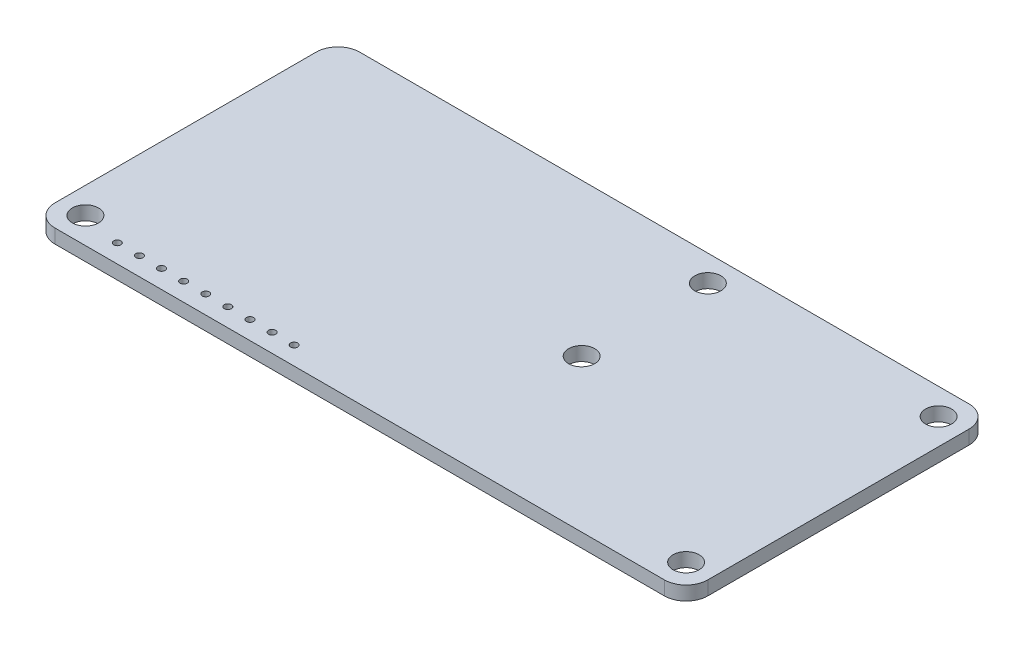
ISO-10303-21;
HEADER;
FILE_DESCRIPTION(('STEP AP214'),'2;1');
FILE_NAME('part.step','',(''),(''),'','','');
FILE_SCHEMA(('AUTOMOTIVE_DESIGN { 1 0 10303 214 1 1 1 1 }'));
ENDSEC;
DATA;
#1=APPLICATION_CONTEXT('core data for automotive mechanical design processes');
#2=APPLICATION_PROTOCOL_DEFINITION('international standard','automotive_design',2000,#1);
#3=PRODUCT_CONTEXT('',#1,'mechanical');
#4=PRODUCT('Part','Part','',(#3));
#5=PRODUCT_RELATED_PRODUCT_CATEGORY('part','',(#4));
#6=PRODUCT_DEFINITION_FORMATION('','',#4);
#7=PRODUCT_DEFINITION_CONTEXT('part definition',#1,'design');
#8=PRODUCT_DEFINITION('design','',#6,#7);
#9=PRODUCT_DEFINITION_SHAPE('','',#8);
#10=(LENGTH_UNIT() NAMED_UNIT(*) SI_UNIT(.MILLI.,.METRE.));
#11=(NAMED_UNIT(*) PLANE_ANGLE_UNIT() SI_UNIT($,.RADIAN.));
#12=(NAMED_UNIT(*) SI_UNIT($,.STERADIAN.) SOLID_ANGLE_UNIT());
#13=UNCERTAINTY_MEASURE_WITH_UNIT(LENGTH_MEASURE(1.E-05),#10,'distance_accuracy_value','');
#14=(GEOMETRIC_REPRESENTATION_CONTEXT(3) GLOBAL_UNCERTAINTY_ASSIGNED_CONTEXT((#13)) GLOBAL_UNIT_ASSIGNED_CONTEXT((#10,
#11,#12)) REPRESENTATION_CONTEXT('',''));
#15=CARTESIAN_POINT('',(0.,0.,0.));
#16=DIRECTION('',(0.,0.,1.));
#17=DIRECTION('',(1.,0.,0.));
#18=AXIS2_PLACEMENT_3D('',#15,#16,#17);
#19=CARTESIAN_POINT('',(-35.,1.6,15.));
#20=DIRECTION('',(0.,-1.,0.));
#21=DIRECTION('',(0.,0.,-1.));
#22=AXIS2_PLACEMENT_3D('',#19,#20,#21);
#23=CYLINDRICAL_SURFACE('',#22,2.5);
#24=CARTESIAN_POINT('',(-35.,0.,15.));
#25=DIRECTION('',(0.,1.,0.));
#26=DIRECTION('',(0.,0.,1.));
#27=AXIS2_PLACEMENT_3D('',#24,#25,#26);
#28=CIRCLE('',#27,2.5);
#29=CARTESIAN_POINT('',(-37.5,0.,15.));
#30=VERTEX_POINT('',#29);
#31=CARTESIAN_POINT('',(-35.,0.,17.5));
#32=VERTEX_POINT('',#31);
#33=EDGE_CURVE('E142',#30,#32,#28,.T.);
#34=ORIENTED_EDGE('',*,*,#33,.T.);
#35=DIRECTION('',(0.,-1.,0.));
#36=VECTOR('',#35,1.);
#37=CARTESIAN_POINT('',(-35.,1.6,17.5));
#38=LINE('',#37,#36);
#39=CARTESIAN_POINT('',(-35.,1.6,17.5));
#40=VERTEX_POINT('',#39);
#41=EDGE_CURVE('E11',#40,#32,#38,.T.);
#42=ORIENTED_EDGE('',*,*,#41,.F.);
#43=CARTESIAN_POINT('',(-35.,1.6,15.));
#44=DIRECTION('',(0.,1.,0.));
#45=DIRECTION('',(0.,0.,1.));
#46=AXIS2_PLACEMENT_3D('',#43,#44,#45);
#47=CIRCLE('',#46,2.5);
#48=CARTESIAN_POINT('',(-37.5,1.6,15.));
#49=VERTEX_POINT('',#48);
#50=EDGE_CURVE('E165',#49,#40,#47,.T.);
#51=ORIENTED_EDGE('',*,*,#50,.F.);
#52=DIRECTION('',(0.,-1.,0.));
#53=VECTOR('',#52,1.);
#54=CARTESIAN_POINT('',(-37.5,1.6,15.));
#55=LINE('',#54,#53);
#56=EDGE_CURVE('E138',#49,#30,#55,.T.);
#57=ORIENTED_EDGE('',*,*,#56,.T.);
#58=EDGE_LOOP('',(#34,#42,#51,#57));
#59=FACE_BOUND('',#58,.T.);
#60=ADVANCED_FACE('F41',(#59),#23,.T.);
#61=CARTESIAN_POINT('',(-35.,1.6,17.5));
#62=DIRECTION('',(0.,0.,-1.));
#63=DIRECTION('',(-1.,0.,0.));
#64=AXIS2_PLACEMENT_3D('',#61,#62,#63);
#65=PLANE('',#64);
#66=DIRECTION('',(1.,0.,0.));
#67=VECTOR('',#66,1.);
#68=CARTESIAN_POINT('',(-35.,0.,17.5));
#69=LINE('',#68,#67);
#70=CARTESIAN_POINT('',(35.,0.,17.5));
#71=VERTEX_POINT('',#70);
#72=EDGE_CURVE('E146',#32,#71,#69,.T.);
#73=ORIENTED_EDGE('',*,*,#72,.T.);
#74=DIRECTION('',(0.,-1.,0.));
#75=VECTOR('',#74,1.);
#76=CARTESIAN_POINT('',(35.,1.6,17.5));
#77=LINE('',#76,#75);
#78=CARTESIAN_POINT('',(35.,1.6,17.5));
#79=VERTEX_POINT('',#78);
#80=EDGE_CURVE('E50',#79,#71,#77,.T.);
#81=ORIENTED_EDGE('',*,*,#80,.F.);
#82=DIRECTION('',(1.,0.,0.));
#83=VECTOR('',#82,1.);
#84=CARTESIAN_POINT('',(-35.,1.6,17.5));
#85=LINE('',#84,#83);
#86=EDGE_CURVE('E101',#40,#79,#85,.T.);
#87=ORIENTED_EDGE('',*,*,#86,.F.);
#88=ORIENTED_EDGE('',*,*,#41,.T.);
#89=EDGE_LOOP('',(#73,#81,#87,#88));
#90=FACE_BOUND('',#89,.T.);
#91=ADVANCED_FACE('F376',(#90),#65,.F.);
#92=CARTESIAN_POINT('',(35.,1.6,15.));
#93=DIRECTION('',(0.,-1.,0.));
#94=DIRECTION('',(0.,0.,-1.));
#95=AXIS2_PLACEMENT_3D('',#92,#93,#94);
#96=CYLINDRICAL_SURFACE('',#95,2.5);
#97=CARTESIAN_POINT('',(35.,0.,15.));
#98=DIRECTION('',(0.,1.,0.));
#99=DIRECTION('',(0.,0.,1.));
#100=AXIS2_PLACEMENT_3D('',#97,#98,#99);
#101=CIRCLE('',#100,2.5);
#102=CARTESIAN_POINT('',(37.5,0.,15.));
#103=VERTEX_POINT('',#102);
#104=EDGE_CURVE('E150',#71,#103,#101,.T.);
#105=ORIENTED_EDGE('',*,*,#104,.T.);
#106=DIRECTION('',(0.,-1.,0.));
#107=VECTOR('',#106,1.);
#108=CARTESIAN_POINT('',(37.5,1.6,15.));
#109=LINE('',#108,#107);
#110=CARTESIAN_POINT('',(37.5,1.6,15.));
#111=VERTEX_POINT('',#110);
#112=EDGE_CURVE('E176',#111,#103,#109,.T.);
#113=ORIENTED_EDGE('',*,*,#112,.F.);
#114=CARTESIAN_POINT('',(35.,1.6,15.));
#115=DIRECTION('',(0.,1.,0.));
#116=DIRECTION('',(0.,0.,1.));
#117=AXIS2_PLACEMENT_3D('',#114,#115,#116);
#118=CIRCLE('',#117,2.5);
#119=EDGE_CURVE('E186',#79,#111,#118,.T.);
#120=ORIENTED_EDGE('',*,*,#119,.F.);
#121=ORIENTED_EDGE('',*,*,#80,.T.);
#122=EDGE_LOOP('',(#105,#113,#120,#121));
#123=FACE_BOUND('',#122,.T.);
#124=ADVANCED_FACE('F184',(#123),#96,.T.);
#125=CARTESIAN_POINT('',(37.5,1.6,-15.));
#126=DIRECTION('',(-1.,0.,0.));
#127=DIRECTION('',(0.,0.,1.));
#128=AXIS2_PLACEMENT_3D('',#125,#126,#127);
#129=PLANE('',#128);
#130=DIRECTION('',(0.,0.,-1.));
#131=VECTOR('',#130,1.);
#132=CARTESIAN_POINT('',(37.5,0.,-15.));
#133=LINE('',#132,#131);
#134=CARTESIAN_POINT('',(37.5,0.,-15.));
#135=VERTEX_POINT('',#134);
#136=EDGE_CURVE('E153',#103,#135,#133,.T.);
#137=ORIENTED_EDGE('',*,*,#136,.T.);
#138=DIRECTION('',(0.,-1.,0.));
#139=VECTOR('',#138,1.);
#140=CARTESIAN_POINT('',(37.5,1.6,-15.));
#141=LINE('',#140,#139);
#142=CARTESIAN_POINT('',(37.5,1.6,-15.));
#143=VERTEX_POINT('',#142);
#144=EDGE_CURVE('E172',#143,#135,#141,.T.);
#145=ORIENTED_EDGE('',*,*,#144,.F.);
#146=DIRECTION('',(0.,0.,-1.));
#147=VECTOR('',#146,1.);
#148=CARTESIAN_POINT('',(37.5,1.6,-15.));
#149=LINE('',#148,#147);
#150=EDGE_CURVE('E199',#111,#143,#149,.T.);
#151=ORIENTED_EDGE('',*,*,#150,.F.);
#152=ORIENTED_EDGE('',*,*,#112,.T.);
#153=EDGE_LOOP('',(#137,#145,#151,#152));
#154=FACE_BOUND('',#153,.T.);
#155=ADVANCED_FACE('F194',(#154),#129,.F.);
#156=CARTESIAN_POINT('',(35.,1.6,-15.));
#157=DIRECTION('',(0.,-1.,0.));
#158=DIRECTION('',(0.,0.,-1.));
#159=AXIS2_PLACEMENT_3D('',#156,#157,#158);
#160=CYLINDRICAL_SURFACE('',#159,2.5);
#161=CARTESIAN_POINT('',(35.,0.,-15.));
#162=DIRECTION('',(0.,1.,0.));
#163=DIRECTION('',(0.,0.,-1.));
#164=AXIS2_PLACEMENT_3D('',#161,#162,#163);
#165=CIRCLE('',#164,2.5);
#166=CARTESIAN_POINT('',(35.,0.,-17.5));
#167=VERTEX_POINT('',#166);
#168=EDGE_CURVE('E156',#135,#167,#165,.T.);
#169=ORIENTED_EDGE('',*,*,#168,.T.);
#170=DIRECTION('',(0.,-1.,0.));
#171=VECTOR('',#170,1.);
#172=CARTESIAN_POINT('',(35.,1.6,-17.5));
#173=LINE('',#172,#171);
#174=CARTESIAN_POINT('',(35.,1.6,-17.5));
#175=VERTEX_POINT('',#174);
#176=EDGE_CURVE('E131',#175,#167,#173,.T.);
#177=ORIENTED_EDGE('',*,*,#176,.F.);
#178=CARTESIAN_POINT('',(35.,1.6,-15.));
#179=DIRECTION('',(0.,1.,0.));
#180=DIRECTION('',(0.,0.,-1.));
#181=AXIS2_PLACEMENT_3D('',#178,#179,#180);
#182=CIRCLE('',#181,2.5);
#183=EDGE_CURVE('E120',#143,#175,#182,.T.);
#184=ORIENTED_EDGE('',*,*,#183,.F.);
#185=ORIENTED_EDGE('',*,*,#144,.T.);
#186=EDGE_LOOP('',(#169,#177,#184,#185));
#187=FACE_BOUND('',#186,.T.);
#188=ADVANCED_FACE('F197',(#187),#160,.T.);
#189=CARTESIAN_POINT('',(-35.,1.6,-17.5));
#190=DIRECTION('',(0.,0.,1.));
#191=DIRECTION('',(1.,0.,0.));
#192=AXIS2_PLACEMENT_3D('',#189,#190,#191);
#193=PLANE('',#192);
#194=DIRECTION('',(-1.,0.,0.));
#195=VECTOR('',#194,1.);
#196=CARTESIAN_POINT('',(-35.,0.,-17.5));
#197=LINE('',#196,#195);
#198=CARTESIAN_POINT('',(-35.,0.,-17.5));
#199=VERTEX_POINT('',#198);
#200=EDGE_CURVE('E129',#167,#199,#197,.T.);
#201=ORIENTED_EDGE('',*,*,#200,.T.);
#202=DIRECTION('',(0.,-1.,0.));
#203=VECTOR('',#202,1.);
#204=CARTESIAN_POINT('',(-35.,1.6,-17.5));
#205=LINE('',#204,#203);
#206=CARTESIAN_POINT('',(-35.,1.6,-17.5));
#207=VERTEX_POINT('',#206);
#208=EDGE_CURVE('E126',#207,#199,#205,.T.);
#209=ORIENTED_EDGE('',*,*,#208,.F.);
#210=DIRECTION('',(-1.,0.,0.));
#211=VECTOR('',#210,1.);
#212=CARTESIAN_POINT('',(-35.,1.6,-17.5));
#213=LINE('',#212,#211);
#214=EDGE_CURVE('E114',#175,#207,#213,.T.);
#215=ORIENTED_EDGE('',*,*,#214,.F.);
#216=ORIENTED_EDGE('',*,*,#176,.T.);
#217=EDGE_LOOP('',(#201,#209,#215,#216));
#218=FACE_BOUND('',#217,.T.);
#219=ADVANCED_FACE('F127',(#218),#193,.F.);
#220=CARTESIAN_POINT('',(-35.,1.6,-15.));
#221=DIRECTION('',(0.,-1.,0.));
#222=DIRECTION('',(0.,0.,-1.));
#223=AXIS2_PLACEMENT_3D('',#220,#221,#222);
#224=CYLINDRICAL_SURFACE('',#223,2.5);
#225=CARTESIAN_POINT('',(-35.,0.,-15.));
#226=DIRECTION('',(0.,1.,0.));
#227=DIRECTION('',(0.,0.,1.));
#228=AXIS2_PLACEMENT_3D('',#225,#226,#227);
#229=CIRCLE('',#228,2.5);
#230=CARTESIAN_POINT('',(-37.5,0.,-15.));
#231=VERTEX_POINT('',#230);
#232=EDGE_CURVE('E87',#199,#231,#229,.T.);
#233=ORIENTED_EDGE('',*,*,#232,.T.);
#234=DIRECTION('',(0.,-1.,0.));
#235=VECTOR('',#234,1.);
#236=CARTESIAN_POINT('',(-37.5,1.6,-15.));
#237=LINE('',#236,#235);
#238=CARTESIAN_POINT('',(-37.5,1.6,-15.));
#239=VERTEX_POINT('',#238);
#240=EDGE_CURVE('E132',#239,#231,#237,.T.);
#241=ORIENTED_EDGE('',*,*,#240,.F.);
#242=CARTESIAN_POINT('',(-35.,1.6,-15.));
#243=DIRECTION('',(0.,1.,0.));
#244=DIRECTION('',(0.,0.,1.));
#245=AXIS2_PLACEMENT_3D('',#242,#243,#244);
#246=CIRCLE('',#245,2.5);
#247=EDGE_CURVE('E118',#207,#239,#246,.T.);
#248=ORIENTED_EDGE('',*,*,#247,.F.);
#249=ORIENTED_EDGE('',*,*,#208,.T.);
#250=EDGE_LOOP('',(#233,#241,#248,#249));
#251=FACE_BOUND('',#250,.T.);
#252=ADVANCED_FACE('F134',(#251),#224,.T.);
#253=CARTESIAN_POINT('',(-37.5,1.6,-15.));
#254=DIRECTION('',(1.,0.,0.));
#255=DIRECTION('',(0.,0.,-1.));
#256=AXIS2_PLACEMENT_3D('',#253,#254,#255);
#257=PLANE('',#256);
#258=DIRECTION('',(0.,0.,1.));
#259=VECTOR('',#258,1.);
#260=CARTESIAN_POINT('',(-37.5,0.,-15.));
#261=LINE('',#260,#259);
#262=EDGE_CURVE('E93',#231,#30,#261,.T.);
#263=ORIENTED_EDGE('',*,*,#262,.T.);
#264=ORIENTED_EDGE('',*,*,#56,.F.);
#265=DIRECTION('',(0.,0.,1.));
#266=VECTOR('',#265,1.);
#267=CARTESIAN_POINT('',(-37.5,1.6,-15.));
#268=LINE('',#267,#266);
#269=EDGE_CURVE('E58',#239,#49,#268,.T.);
#270=ORIENTED_EDGE('',*,*,#269,.F.);
#271=ORIENTED_EDGE('',*,*,#240,.T.);
#272=EDGE_LOOP('',(#263,#264,#270,#271));
#273=FACE_BOUND('',#272,.T.);
#274=ADVANCED_FACE('F332',(#273),#257,.F.);
#275=CARTESIAN_POINT('',(-35.,1.6,15.));
#276=DIRECTION('',(0.,1.,0.));
#277=DIRECTION('',(0.,0.,1.));
#278=AXIS2_PLACEMENT_3D('',#275,#276,#277);
#279=PLANE('',#278);
#280=CARTESIAN_POINT('',(-34.5,1.6,14.5));
#281=DIRECTION('',(0.,1.,0.));
#282=DIRECTION('',(0.,0.,1.));
#283=AXIS2_PLACEMENT_3D('',#280,#281,#282);
#284=CIRCLE('',#283,1.5);
#285=CARTESIAN_POINT('',(-34.5,1.6,16.));
#286=VERTEX_POINT('',#285);
#287=EDGE_CURVE('E274',#286,#286,#284,.T.);
#288=ORIENTED_EDGE('',*,*,#287,.F.);
#289=EDGE_LOOP('',(#288));
#290=FACE_BOUND('',#289,.T.);
#291=CARTESIAN_POINT('',(-9.62018139004444,1.6,15.3993105585217));
#292=DIRECTION('',(0.,1.,0.));
#293=DIRECTION('',(0.,0.,1.));
#294=AXIS2_PLACEMENT_3D('',#291,#292,#293);
#295=CIRCLE('',#294,0.406594982214174);
#296=CARTESIAN_POINT('',(-9.62018139004444,1.6,15.8059055407359));
#297=VERTEX_POINT('',#296);
#298=EDGE_CURVE('E275',#297,#297,#295,.T.);
#299=ORIENTED_EDGE('',*,*,#298,.F.);
#300=EDGE_LOOP('',(#299));
#301=FACE_BOUND('',#300,.T.);
#302=CARTESIAN_POINT('',(-12.1601813900444,1.6,15.3993105585217));
#303=DIRECTION('',(0.,1.,0.));
#304=DIRECTION('',(0.,0.,1.));
#305=AXIS2_PLACEMENT_3D('',#302,#303,#304);
#306=CIRCLE('',#305,0.406594982214174);
#307=CARTESIAN_POINT('',(-12.1601813900444,1.6,15.8059055407359));
#308=VERTEX_POINT('',#307);
#309=EDGE_CURVE('E283',#308,#308,#306,.T.);
#310=ORIENTED_EDGE('',*,*,#309,.F.);
#311=EDGE_LOOP('',(#310));
#312=FACE_BOUND('',#311,.T.);
#313=CARTESIAN_POINT('',(-14.7001813900444,1.6,15.3993105585217));
#314=DIRECTION('',(0.,1.,0.));
#315=DIRECTION('',(0.,0.,1.));
#316=AXIS2_PLACEMENT_3D('',#313,#314,#315);
#317=CIRCLE('',#316,0.406594982214174);
#318=CARTESIAN_POINT('',(-14.7001813900444,1.6,15.8059055407359));
#319=VERTEX_POINT('',#318);
#320=EDGE_CURVE('E291',#319,#319,#317,.T.);
#321=ORIENTED_EDGE('',*,*,#320,.F.);
#322=EDGE_LOOP('',(#321));
#323=FACE_BOUND('',#322,.T.);
#324=CARTESIAN_POINT('',(-17.2401813900444,1.6,15.3993105585217));
#325=DIRECTION('',(0.,1.,0.));
#326=DIRECTION('',(0.,0.,1.));
#327=AXIS2_PLACEMENT_3D('',#324,#325,#326);
#328=CIRCLE('',#327,0.40659498221417);
#329=CARTESIAN_POINT('',(-17.2401813900444,1.6,15.8059055407359));
#330=VERTEX_POINT('',#329);
#331=EDGE_CURVE('E299',#330,#330,#328,.T.);
#332=ORIENTED_EDGE('',*,*,#331,.F.);
#333=EDGE_LOOP('',(#332));
#334=FACE_BOUND('',#333,.T.);
#335=CARTESIAN_POINT('',(-19.7801813900444,1.6,15.3993105585217));
#336=DIRECTION('',(0.,1.,0.));
#337=DIRECTION('',(0.,0.,1.));
#338=AXIS2_PLACEMENT_3D('',#335,#336,#337);
#339=CIRCLE('',#338,0.40659498221417);
#340=CARTESIAN_POINT('',(-19.7801813900444,1.6,15.8059055407359));
#341=VERTEX_POINT('',#340);
#342=EDGE_CURVE('E307',#341,#341,#339,.T.);
#343=ORIENTED_EDGE('',*,*,#342,.F.);
#344=EDGE_LOOP('',(#343));
#345=FACE_BOUND('',#344,.T.);
#346=CARTESIAN_POINT('',(-22.3201813900444,1.6,15.3993105585217));
#347=DIRECTION('',(0.,1.,0.));
#348=DIRECTION('',(0.,0.,1.));
#349=AXIS2_PLACEMENT_3D('',#346,#347,#348);
#350=CIRCLE('',#349,0.40659498221417);
#351=CARTESIAN_POINT('',(-22.3201813900444,1.6,15.8059055407359));
#352=VERTEX_POINT('',#351);
#353=EDGE_CURVE('E209',#352,#352,#350,.T.);
#354=ORIENTED_EDGE('',*,*,#353,.F.);
#355=EDGE_LOOP('',(#354));
#356=FACE_BOUND('',#355,.T.);
#357=CARTESIAN_POINT('',(-24.8601813900444,1.6,15.3993105585217));
#358=DIRECTION('',(0.,1.,0.));
#359=DIRECTION('',(0.,0.,1.));
#360=AXIS2_PLACEMENT_3D('',#357,#358,#359);
#361=CIRCLE('',#360,0.406594982214174);
#362=CARTESIAN_POINT('',(-24.8601813900444,1.6,15.8059055407359));
#363=VERTEX_POINT('',#362);
#364=EDGE_CURVE('E218',#363,#363,#361,.T.);
#365=ORIENTED_EDGE('',*,*,#364,.F.);
#366=EDGE_LOOP('',(#365));
#367=FACE_BOUND('',#366,.T.);
#368=CARTESIAN_POINT('',(-27.4001813900444,1.6,15.3993105585217));
#369=DIRECTION('',(0.,1.,0.));
#370=DIRECTION('',(0.,0.,1.));
#371=AXIS2_PLACEMENT_3D('',#368,#369,#370);
#372=CIRCLE('',#371,0.406594982214174);
#373=CARTESIAN_POINT('',(-27.4001813900444,1.6,15.8059055407359));
#374=VERTEX_POINT('',#373);
#375=EDGE_CURVE('E226',#374,#374,#372,.T.);
#376=ORIENTED_EDGE('',*,*,#375,.F.);
#377=EDGE_LOOP('',(#376));
#378=FACE_BOUND('',#377,.T.);
#379=CARTESIAN_POINT('',(-29.9401813900444,1.6,15.3993105585217));
#380=DIRECTION('',(0.,1.,0.));
#381=DIRECTION('',(0.,0.,1.));
#382=AXIS2_PLACEMENT_3D('',#379,#380,#381);
#383=CIRCLE('',#382,0.406594982214174);
#384=CARTESIAN_POINT('',(-29.9401813900444,1.6,15.8059055407359));
#385=VERTEX_POINT('',#384);
#386=EDGE_CURVE('E234',#385,#385,#383,.T.);
#387=ORIENTED_EDGE('',*,*,#386,.F.);
#388=EDGE_LOOP('',(#387));
#389=FACE_BOUND('',#388,.T.);
#390=CARTESIAN_POINT('',(8.00000000000002,1.6,-14.5));
#391=DIRECTION('',(0.,1.,0.));
#392=DIRECTION('',(0.,0.,1.));
#393=AXIS2_PLACEMENT_3D('',#390,#391,#392);
#394=CIRCLE('',#393,1.5);
#395=CARTESIAN_POINT('',(8.00000000000002,1.6,-13.));
#396=VERTEX_POINT('',#395);
#397=EDGE_CURVE('E242',#396,#396,#394,.T.);
#398=ORIENTED_EDGE('',*,*,#397,.F.);
#399=EDGE_LOOP('',(#398));
#400=FACE_BOUND('',#399,.T.);
#401=CARTESIAN_POINT('',(8.00000000000002,1.6,0.));
#402=DIRECTION('',(0.,1.,0.));
#403=DIRECTION('',(0.,0.,1.));
#404=AXIS2_PLACEMENT_3D('',#401,#402,#403);
#405=CIRCLE('',#404,1.5);
#406=CARTESIAN_POINT('',(8.00000000000002,1.6,1.49999999999999));
#407=VERTEX_POINT('',#406);
#408=EDGE_CURVE('E250',#407,#407,#405,.T.);
#409=ORIENTED_EDGE('',*,*,#408,.F.);
#410=EDGE_LOOP('',(#409));
#411=FACE_BOUND('',#410,.T.);
#412=CARTESIAN_POINT('',(34.5,1.6,-14.5));
#413=DIRECTION('',(0.,1.,0.));
#414=DIRECTION('',(0.,0.,1.));
#415=AXIS2_PLACEMENT_3D('',#412,#413,#414);
#416=CIRCLE('',#415,1.5);
#417=CARTESIAN_POINT('',(34.5,1.6,-13.));
#418=VERTEX_POINT('',#417);
#419=EDGE_CURVE('E258',#418,#418,#416,.T.);
#420=ORIENTED_EDGE('',*,*,#419,.F.);
#421=EDGE_LOOP('',(#420));
#422=FACE_BOUND('',#421,.T.);
#423=CARTESIAN_POINT('',(34.5,1.6,14.5));
#424=DIRECTION('',(0.,1.,0.));
#425=DIRECTION('',(0.,0.,1.));
#426=AXIS2_PLACEMENT_3D('',#423,#424,#425);
#427=CIRCLE('',#426,1.5);
#428=CARTESIAN_POINT('',(34.5,1.6,16.));
#429=VERTEX_POINT('',#428);
#430=EDGE_CURVE('E266',#429,#429,#427,.T.);
#431=ORIENTED_EDGE('',*,*,#430,.F.);
#432=EDGE_LOOP('',(#431));
#433=FACE_BOUND('',#432,.T.);
#434=ORIENTED_EDGE('',*,*,#50,.T.);
#435=ORIENTED_EDGE('',*,*,#86,.T.);
#436=ORIENTED_EDGE('',*,*,#119,.T.);
#437=ORIENTED_EDGE('',*,*,#150,.T.);
#438=ORIENTED_EDGE('',*,*,#183,.T.);
#439=ORIENTED_EDGE('',*,*,#214,.T.);
#440=ORIENTED_EDGE('',*,*,#247,.T.);
#441=ORIENTED_EDGE('',*,*,#269,.T.);
#442=EDGE_LOOP('',(#434,#435,#436,#437,#438,#439,#440,#441));
#443=FACE_BOUND('',#442,.T.);
#444=ADVANCED_FACE('F116',(#290,#301,#312,#323,#334,#345,#356,#367,#378,#389,#400,#411,#422,
#433,#443),#279,.T.);
#445=CARTESIAN_POINT('',(-35.,0.,15.));
#446=DIRECTION('',(0.,1.,0.));
#447=DIRECTION('',(0.,0.,1.));
#448=AXIS2_PLACEMENT_3D('',#445,#446,#447);
#449=PLANE('',#448);
#450=CARTESIAN_POINT('',(-34.5,0.,14.5));
#451=DIRECTION('',(0.,1.,0.));
#452=DIRECTION('',(0.,0.,1.));
#453=AXIS2_PLACEMENT_3D('',#450,#451,#452);
#454=CIRCLE('',#453,1.5);
#455=CARTESIAN_POINT('',(-34.5,0.,16.));
#456=VERTEX_POINT('',#455);
#457=EDGE_CURVE('E147',#456,#456,#454,.T.);
#458=ORIENTED_EDGE('',*,*,#457,.T.);
#459=EDGE_LOOP('',(#458));
#460=FACE_BOUND('',#459,.T.);
#461=CARTESIAN_POINT('',(-9.62018139004444,0.,15.3993105585217));
#462=DIRECTION('',(0.,1.,0.));
#463=DIRECTION('',(0.,0.,1.));
#464=AXIS2_PLACEMENT_3D('',#461,#462,#463);
#465=CIRCLE('',#464,0.406594982214174);
#466=CARTESIAN_POINT('',(-9.62018139004444,0.,15.8059055407359));
#467=VERTEX_POINT('',#466);
#468=EDGE_CURVE('E279',#467,#467,#465,.T.);
#469=ORIENTED_EDGE('',*,*,#468,.T.);
#470=EDGE_LOOP('',(#469));
#471=FACE_BOUND('',#470,.T.);
#472=CARTESIAN_POINT('',(-12.1601813900444,0.,15.3993105585217));
#473=DIRECTION('',(0.,1.,0.));
#474=DIRECTION('',(0.,0.,1.));
#475=AXIS2_PLACEMENT_3D('',#472,#473,#474);
#476=CIRCLE('',#475,0.406594982214174);
#477=CARTESIAN_POINT('',(-12.1601813900444,0.,15.8059055407359));
#478=VERTEX_POINT('',#477);
#479=EDGE_CURVE('E287',#478,#478,#476,.T.);
#480=ORIENTED_EDGE('',*,*,#479,.T.);
#481=EDGE_LOOP('',(#480));
#482=FACE_BOUND('',#481,.T.);
#483=CARTESIAN_POINT('',(-14.7001813900444,0.,15.3993105585217));
#484=DIRECTION('',(0.,1.,0.));
#485=DIRECTION('',(0.,0.,1.));
#486=AXIS2_PLACEMENT_3D('',#483,#484,#485);
#487=CIRCLE('',#486,0.406594982214174);
#488=CARTESIAN_POINT('',(-14.7001813900444,0.,15.8059055407359));
#489=VERTEX_POINT('',#488);
#490=EDGE_CURVE('E295',#489,#489,#487,.T.);
#491=ORIENTED_EDGE('',*,*,#490,.T.);
#492=EDGE_LOOP('',(#491));
#493=FACE_BOUND('',#492,.T.);
#494=CARTESIAN_POINT('',(-17.2401813900444,0.,15.3993105585217));
#495=DIRECTION('',(0.,1.,0.));
#496=DIRECTION('',(0.,0.,1.));
#497=AXIS2_PLACEMENT_3D('',#494,#495,#496);
#498=CIRCLE('',#497,0.40659498221417);
#499=CARTESIAN_POINT('',(-17.2401813900444,0.,15.8059055407359));
#500=VERTEX_POINT('',#499);
#501=EDGE_CURVE('E303',#500,#500,#498,.T.);
#502=ORIENTED_EDGE('',*,*,#501,.T.);
#503=EDGE_LOOP('',(#502));
#504=FACE_BOUND('',#503,.T.);
#505=CARTESIAN_POINT('',(-19.7801813900444,0.,15.3993105585217));
#506=DIRECTION('',(0.,1.,0.));
#507=DIRECTION('',(0.,0.,1.));
#508=AXIS2_PLACEMENT_3D('',#505,#506,#507);
#509=CIRCLE('',#508,0.40659498221417);
#510=CARTESIAN_POINT('',(-19.7801813900444,0.,15.8059055407359));
#511=VERTEX_POINT('',#510);
#512=EDGE_CURVE('E214',#511,#511,#509,.T.);
#513=ORIENTED_EDGE('',*,*,#512,.T.);
#514=EDGE_LOOP('',(#513));
#515=FACE_BOUND('',#514,.T.);
#516=CARTESIAN_POINT('',(-22.3201813900444,0.,15.3993105585217));
#517=DIRECTION('',(0.,1.,0.));
#518=DIRECTION('',(0.,0.,1.));
#519=AXIS2_PLACEMENT_3D('',#516,#517,#518);
#520=CIRCLE('',#519,0.40659498221417);
#521=CARTESIAN_POINT('',(-22.3201813900444,0.,15.8059055407359));
#522=VERTEX_POINT('',#521);
#523=EDGE_CURVE('E213',#522,#522,#520,.T.);
#524=ORIENTED_EDGE('',*,*,#523,.T.);
#525=EDGE_LOOP('',(#524));
#526=FACE_BOUND('',#525,.T.);
#527=CARTESIAN_POINT('',(-24.8601813900444,0.,15.3993105585217));
#528=DIRECTION('',(0.,1.,0.));
#529=DIRECTION('',(0.,0.,1.));
#530=AXIS2_PLACEMENT_3D('',#527,#528,#529);
#531=CIRCLE('',#530,0.406594982214174);
#532=CARTESIAN_POINT('',(-24.8601813900444,0.,15.8059055407359));
#533=VERTEX_POINT('',#532);
#534=EDGE_CURVE('E222',#533,#533,#531,.T.);
#535=ORIENTED_EDGE('',*,*,#534,.T.);
#536=EDGE_LOOP('',(#535));
#537=FACE_BOUND('',#536,.T.);
#538=CARTESIAN_POINT('',(-27.4001813900444,0.,15.3993105585217));
#539=DIRECTION('',(0.,1.,0.));
#540=DIRECTION('',(0.,0.,1.));
#541=AXIS2_PLACEMENT_3D('',#538,#539,#540);
#542=CIRCLE('',#541,0.406594982214174);
#543=CARTESIAN_POINT('',(-27.4001813900444,0.,15.8059055407359));
#544=VERTEX_POINT('',#543);
#545=EDGE_CURVE('E230',#544,#544,#542,.T.);
#546=ORIENTED_EDGE('',*,*,#545,.T.);
#547=EDGE_LOOP('',(#546));
#548=FACE_BOUND('',#547,.T.);
#549=CARTESIAN_POINT('',(-29.9401813900444,0.,15.3993105585217));
#550=DIRECTION('',(0.,1.,0.));
#551=DIRECTION('',(0.,0.,1.));
#552=AXIS2_PLACEMENT_3D('',#549,#550,#551);
#553=CIRCLE('',#552,0.406594982214174);
#554=CARTESIAN_POINT('',(-29.9401813900444,0.,15.8059055407359));
#555=VERTEX_POINT('',#554);
#556=EDGE_CURVE('E238',#555,#555,#553,.T.);
#557=ORIENTED_EDGE('',*,*,#556,.T.);
#558=EDGE_LOOP('',(#557));
#559=FACE_BOUND('',#558,.T.);
#560=CARTESIAN_POINT('',(8.00000000000002,0.,-14.5));
#561=DIRECTION('',(0.,1.,0.));
#562=DIRECTION('',(0.,0.,1.));
#563=AXIS2_PLACEMENT_3D('',#560,#561,#562);
#564=CIRCLE('',#563,1.5);
#565=CARTESIAN_POINT('',(8.00000000000002,0.,-13.));
#566=VERTEX_POINT('',#565);
#567=EDGE_CURVE('E246',#566,#566,#564,.T.);
#568=ORIENTED_EDGE('',*,*,#567,.T.);
#569=EDGE_LOOP('',(#568));
#570=FACE_BOUND('',#569,.T.);
#571=CARTESIAN_POINT('',(8.00000000000002,0.,0.));
#572=DIRECTION('',(0.,1.,0.));
#573=DIRECTION('',(0.,0.,1.));
#574=AXIS2_PLACEMENT_3D('',#571,#572,#573);
#575=CIRCLE('',#574,1.5);
#576=CARTESIAN_POINT('',(8.00000000000002,0.,1.49999999999999));
#577=VERTEX_POINT('',#576);
#578=EDGE_CURVE('E254',#577,#577,#575,.T.);
#579=ORIENTED_EDGE('',*,*,#578,.T.);
#580=EDGE_LOOP('',(#579));
#581=FACE_BOUND('',#580,.T.);
#582=CARTESIAN_POINT('',(34.5,0.,-14.5));
#583=DIRECTION('',(0.,1.,0.));
#584=DIRECTION('',(0.,0.,1.));
#585=AXIS2_PLACEMENT_3D('',#582,#583,#584);
#586=CIRCLE('',#585,1.5);
#587=CARTESIAN_POINT('',(34.5,0.,-13.));
#588=VERTEX_POINT('',#587);
#589=EDGE_CURVE('E262',#588,#588,#586,.T.);
#590=ORIENTED_EDGE('',*,*,#589,.T.);
#591=EDGE_LOOP('',(#590));
#592=FACE_BOUND('',#591,.T.);
#593=CARTESIAN_POINT('',(34.5,0.,14.5));
#594=DIRECTION('',(0.,1.,0.));
#595=DIRECTION('',(0.,0.,1.));
#596=AXIS2_PLACEMENT_3D('',#593,#594,#595);
#597=CIRCLE('',#596,1.5);
#598=CARTESIAN_POINT('',(34.5,0.,16.));
#599=VERTEX_POINT('',#598);
#600=EDGE_CURVE('E270',#599,#599,#597,.T.);
#601=ORIENTED_EDGE('',*,*,#600,.T.);
#602=EDGE_LOOP('',(#601));
#603=FACE_BOUND('',#602,.T.);
#604=ORIENTED_EDGE('',*,*,#33,.F.);
#605=ORIENTED_EDGE('',*,*,#262,.F.);
#606=ORIENTED_EDGE('',*,*,#232,.F.);
#607=ORIENTED_EDGE('',*,*,#200,.F.);
#608=ORIENTED_EDGE('',*,*,#168,.F.);
#609=ORIENTED_EDGE('',*,*,#136,.F.);
#610=ORIENTED_EDGE('',*,*,#104,.F.);
#611=ORIENTED_EDGE('',*,*,#72,.F.);
#612=EDGE_LOOP('',(#604,#605,#606,#607,#608,#609,#610,#611));
#613=FACE_BOUND('',#612,.T.);
#614=ADVANCED_FACE('F190',(#460,#471,#482,#493,#504,#515,#526,#537,#548,#559,#570,#581,#592,
#603,#613),#449,.F.);
#615=CARTESIAN_POINT('',(34.5,0.,14.5));
#616=DIRECTION('',(0.,1.,0.));
#617=DIRECTION('',(0.,0.,1.));
#618=AXIS2_PLACEMENT_3D('',#615,#616,#617);
#619=CYLINDRICAL_SURFACE('',#618,1.5);
#620=ORIENTED_EDGE('',*,*,#600,.F.);
#621=EDGE_LOOP('',(#620));
#622=FACE_BOUND('',#621,.T.);
#623=ORIENTED_EDGE('',*,*,#430,.T.);
#624=EDGE_LOOP('',(#623));
#625=FACE_BOUND('',#624,.T.);
#626=ADVANCED_FACE('F360',(#622,#625),#619,.F.);
#627=CARTESIAN_POINT('',(34.5,0.,-14.5));
#628=DIRECTION('',(0.,1.,0.));
#629=DIRECTION('',(0.,0.,1.));
#630=AXIS2_PLACEMENT_3D('',#627,#628,#629);
#631=CYLINDRICAL_SURFACE('',#630,1.5);
#632=ORIENTED_EDGE('',*,*,#589,.F.);
#633=EDGE_LOOP('',(#632));
#634=FACE_BOUND('',#633,.T.);
#635=ORIENTED_EDGE('',*,*,#419,.T.);
#636=EDGE_LOOP('',(#635));
#637=FACE_BOUND('',#636,.T.);
#638=ADVANCED_FACE('F362',(#634,#637),#631,.F.);
#639=CARTESIAN_POINT('',(8.00000000000002,0.,0.));
#640=DIRECTION('',(0.,1.,0.));
#641=DIRECTION('',(0.,0.,1.));
#642=AXIS2_PLACEMENT_3D('',#639,#640,#641);
#643=CYLINDRICAL_SURFACE('',#642,1.5);
#644=ORIENTED_EDGE('',*,*,#578,.F.);
#645=EDGE_LOOP('',(#644));
#646=FACE_BOUND('',#645,.T.);
#647=ORIENTED_EDGE('',*,*,#408,.T.);
#648=EDGE_LOOP('',(#647));
#649=FACE_BOUND('',#648,.T.);
#650=ADVANCED_FACE('F369',(#646,#649),#643,.F.);
#651=CARTESIAN_POINT('',(8.00000000000002,0.,-14.5));
#652=DIRECTION('',(0.,1.,0.));
#653=DIRECTION('',(0.,0.,1.));
#654=AXIS2_PLACEMENT_3D('',#651,#652,#653);
#655=CYLINDRICAL_SURFACE('',#654,1.5);
#656=ORIENTED_EDGE('',*,*,#567,.F.);
#657=EDGE_LOOP('',(#656));
#658=FACE_BOUND('',#657,.T.);
#659=ORIENTED_EDGE('',*,*,#397,.T.);
#660=EDGE_LOOP('',(#659));
#661=FACE_BOUND('',#660,.T.);
#662=ADVANCED_FACE('F454',(#658,#661),#655,.F.);
#663=CARTESIAN_POINT('',(-29.9401813900444,0.,15.3993105585217));
#664=DIRECTION('',(0.,1.,0.));
#665=DIRECTION('',(0.,0.,1.));
#666=AXIS2_PLACEMENT_3D('',#663,#664,#665);
#667=CYLINDRICAL_SURFACE('',#666,0.406594982214174);
#668=ORIENTED_EDGE('',*,*,#556,.F.);
#669=EDGE_LOOP('',(#668));
#670=FACE_BOUND('',#669,.T.);
#671=ORIENTED_EDGE('',*,*,#386,.T.);
#672=EDGE_LOOP('',(#671));
#673=FACE_BOUND('',#672,.T.);
#674=ADVANCED_FACE('F464',(#670,#673),#667,.F.);
#675=CARTESIAN_POINT('',(-27.4001813900444,0.,15.3993105585217));
#676=DIRECTION('',(0.,1.,0.));
#677=DIRECTION('',(0.,0.,1.));
#678=AXIS2_PLACEMENT_3D('',#675,#676,#677);
#679=CYLINDRICAL_SURFACE('',#678,0.406594982214174);
#680=ORIENTED_EDGE('',*,*,#545,.F.);
#681=EDGE_LOOP('',(#680));
#682=FACE_BOUND('',#681,.T.);
#683=ORIENTED_EDGE('',*,*,#375,.T.);
#684=EDGE_LOOP('',(#683));
#685=FACE_BOUND('',#684,.T.);
#686=ADVANCED_FACE('F474',(#682,#685),#679,.F.);
#687=CARTESIAN_POINT('',(-24.8601813900444,0.,15.3993105585217));
#688=DIRECTION('',(0.,1.,0.));
#689=DIRECTION('',(0.,0.,1.));
#690=AXIS2_PLACEMENT_3D('',#687,#688,#689);
#691=CYLINDRICAL_SURFACE('',#690,0.406594982214174);
#692=ORIENTED_EDGE('',*,*,#534,.F.);
#693=EDGE_LOOP('',(#692));
#694=FACE_BOUND('',#693,.T.);
#695=ORIENTED_EDGE('',*,*,#364,.T.);
#696=EDGE_LOOP('',(#695));
#697=FACE_BOUND('',#696,.T.);
#698=ADVANCED_FACE('F484',(#694,#697),#691,.F.);
#699=CARTESIAN_POINT('',(-22.3201813900444,0.,15.3993105585217));
#700=DIRECTION('',(0.,1.,0.));
#701=DIRECTION('',(0.,0.,1.));
#702=AXIS2_PLACEMENT_3D('',#699,#700,#701);
#703=CYLINDRICAL_SURFACE('',#702,0.40659498221417);
#704=ORIENTED_EDGE('',*,*,#523,.F.);
#705=EDGE_LOOP('',(#704));
#706=FACE_BOUND('',#705,.T.);
#707=ORIENTED_EDGE('',*,*,#353,.T.);
#708=EDGE_LOOP('',(#707));
#709=FACE_BOUND('',#708,.T.);
#710=ADVANCED_FACE('F494',(#706,#709),#703,.F.);
#711=CARTESIAN_POINT('',(-19.7801813900444,0.,15.3993105585217));
#712=DIRECTION('',(0.,1.,0.));
#713=DIRECTION('',(0.,0.,1.));
#714=AXIS2_PLACEMENT_3D('',#711,#712,#713);
#715=CYLINDRICAL_SURFACE('',#714,0.40659498221417);
#716=ORIENTED_EDGE('',*,*,#512,.F.);
#717=EDGE_LOOP('',(#716));
#718=FACE_BOUND('',#717,.T.);
#719=ORIENTED_EDGE('',*,*,#342,.T.);
#720=EDGE_LOOP('',(#719));
#721=FACE_BOUND('',#720,.T.);
#722=ADVANCED_FACE('F504',(#718,#721),#715,.F.);
#723=CARTESIAN_POINT('',(-17.2401813900444,0.,15.3993105585217));
#724=DIRECTION('',(0.,1.,0.));
#725=DIRECTION('',(0.,0.,1.));
#726=AXIS2_PLACEMENT_3D('',#723,#724,#725);
#727=CYLINDRICAL_SURFACE('',#726,0.40659498221417);
#728=ORIENTED_EDGE('',*,*,#501,.F.);
#729=EDGE_LOOP('',(#728));
#730=FACE_BOUND('',#729,.T.);
#731=ORIENTED_EDGE('',*,*,#331,.T.);
#732=EDGE_LOOP('',(#731));
#733=FACE_BOUND('',#732,.T.);
#734=ADVANCED_FACE('F514',(#730,#733),#727,.F.);
#735=CARTESIAN_POINT('',(-14.7001813900444,0.,15.3993105585217));
#736=DIRECTION('',(0.,1.,0.));
#737=DIRECTION('',(0.,0.,1.));
#738=AXIS2_PLACEMENT_3D('',#735,#736,#737);
#739=CYLINDRICAL_SURFACE('',#738,0.406594982214174);
#740=ORIENTED_EDGE('',*,*,#490,.F.);
#741=EDGE_LOOP('',(#740));
#742=FACE_BOUND('',#741,.T.);
#743=ORIENTED_EDGE('',*,*,#320,.T.);
#744=EDGE_LOOP('',(#743));
#745=FACE_BOUND('',#744,.T.);
#746=ADVANCED_FACE('F524',(#742,#745),#739,.F.);
#747=CARTESIAN_POINT('',(-12.1601813900444,0.,15.3993105585217));
#748=DIRECTION('',(0.,1.,0.));
#749=DIRECTION('',(0.,0.,1.));
#750=AXIS2_PLACEMENT_3D('',#747,#748,#749);
#751=CYLINDRICAL_SURFACE('',#750,0.406594982214174);
#752=ORIENTED_EDGE('',*,*,#479,.F.);
#753=EDGE_LOOP('',(#752));
#754=FACE_BOUND('',#753,.T.);
#755=ORIENTED_EDGE('',*,*,#309,.T.);
#756=EDGE_LOOP('',(#755));
#757=FACE_BOUND('',#756,.T.);
#758=ADVANCED_FACE('F534',(#754,#757),#751,.F.);
#759=CARTESIAN_POINT('',(-9.62018139004444,0.,15.3993105585217));
#760=DIRECTION('',(0.,1.,0.));
#761=DIRECTION('',(0.,0.,1.));
#762=AXIS2_PLACEMENT_3D('',#759,#760,#761);
#763=CYLINDRICAL_SURFACE('',#762,0.406594982214174);
#764=ORIENTED_EDGE('',*,*,#468,.F.);
#765=EDGE_LOOP('',(#764));
#766=FACE_BOUND('',#765,.T.);
#767=ORIENTED_EDGE('',*,*,#298,.T.);
#768=EDGE_LOOP('',(#767));
#769=FACE_BOUND('',#768,.T.);
#770=ADVANCED_FACE('F326',(#766,#769),#763,.F.);
#771=CARTESIAN_POINT('',(-34.5,0.,14.5));
#772=DIRECTION('',(0.,1.,0.));
#773=DIRECTION('',(0.,0.,1.));
#774=AXIS2_PLACEMENT_3D('',#771,#772,#773);
#775=CYLINDRICAL_SURFACE('',#774,1.5);
#776=ORIENTED_EDGE('',*,*,#457,.F.);
#777=EDGE_LOOP('',(#776));
#778=FACE_BOUND('',#777,.T.);
#779=ORIENTED_EDGE('',*,*,#287,.T.);
#780=EDGE_LOOP('',(#779));
#781=FACE_BOUND('',#780,.T.);
#782=ADVANCED_FACE('F323',(#778,#781),#775,.F.);
#783=CLOSED_SHELL('',(#60,#91,#124,#155,#188,#219,#252,#274,#444,#614,#626,#638,#650,#662,#674,
#686,#698,#710,#722,#734,#746,#758,#770,#782));
#784=MANIFOLD_SOLID_BREP('B2',#783);
#785=ADVANCED_BREP_SHAPE_REPRESENTATION('',(#18,#784),#14);
#786=SHAPE_DEFINITION_REPRESENTATION(#9,#785);
ENDSEC;
END-ISO-10303-21;
